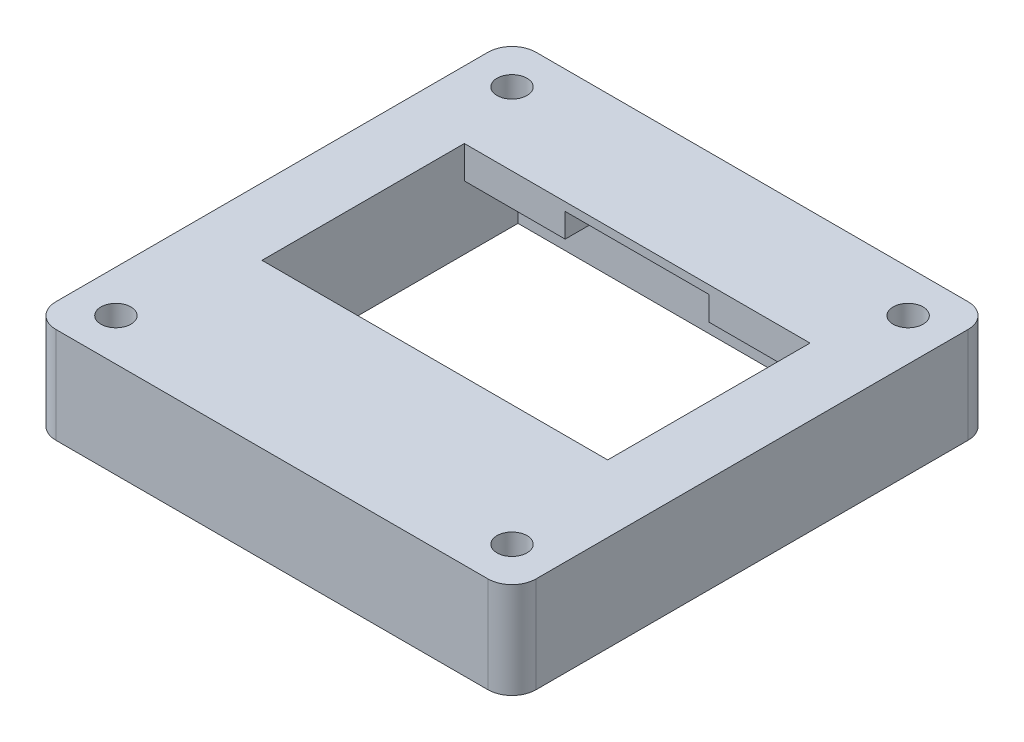
ISO-10303-21;
HEADER;
FILE_DESCRIPTION(('STEP AP214'),'2;1');
FILE_NAME('part.step','',(''),(''),'','','');
FILE_SCHEMA(('AUTOMOTIVE_DESIGN { 1 0 10303 214 1 1 1 1 }'));
ENDSEC;
DATA;
#1=APPLICATION_CONTEXT('core data for automotive mechanical design processes');
#2=APPLICATION_PROTOCOL_DEFINITION('international standard','automotive_design',2000,#1);
#3=PRODUCT_CONTEXT('',#1,'mechanical');
#4=PRODUCT('Part','Part','',(#3));
#5=PRODUCT_RELATED_PRODUCT_CATEGORY('part','',(#4));
#6=PRODUCT_DEFINITION_FORMATION('','',#4);
#7=PRODUCT_DEFINITION_CONTEXT('part definition',#1,'design');
#8=PRODUCT_DEFINITION('design','',#6,#7);
#9=PRODUCT_DEFINITION_SHAPE('','',#8);
#10=(LENGTH_UNIT() NAMED_UNIT(*) SI_UNIT(.MILLI.,.METRE.));
#11=(NAMED_UNIT(*) PLANE_ANGLE_UNIT() SI_UNIT($,.RADIAN.));
#12=(NAMED_UNIT(*) SI_UNIT($,.STERADIAN.) SOLID_ANGLE_UNIT());
#13=UNCERTAINTY_MEASURE_WITH_UNIT(LENGTH_MEASURE(1.E-05),#10,'distance_accuracy_value','');
#14=(GEOMETRIC_REPRESENTATION_CONTEXT(3) GLOBAL_UNCERTAINTY_ASSIGNED_CONTEXT((#13)) GLOBAL_UNIT_ASSIGNED_CONTEXT((#10,
#11,#12)) REPRESENTATION_CONTEXT('',''));
#15=CARTESIAN_POINT('',(0.,0.,0.));
#16=DIRECTION('',(0.,0.,1.));
#17=DIRECTION('',(1.,0.,0.));
#18=AXIS2_PLACEMENT_3D('',#15,#16,#17);
#19=CARTESIAN_POINT('',(-14.4,49.4424902726658,-14.9));
#20=DIRECTION('',(-1.,0.,0.));
#21=DIRECTION('',(0.,0.,1.));
#22=AXIS2_PLACEMENT_3D('',#19,#20,#21);
#23=PLANE('',#22);
#24=DIRECTION('',(0.,0.,1.));
#25=VECTOR('',#24,1.);
#26=CARTESIAN_POINT('',(-14.4,7.5,6.43));
#27=LINE('',#26,#25);
#28=CARTESIAN_POINT('',(-14.4,7.5,6.43));
#29=VERTEX_POINT('',#28);
#30=CARTESIAN_POINT('',(-14.4,7.5,10.43));
#31=VERTEX_POINT('',#30);
#32=EDGE_CURVE('E226',#29,#31,#27,.T.);
#33=ORIENTED_EDGE('',*,*,#32,.T.);
#34=DIRECTION('',(0.,-1.,0.));
#35=VECTOR('',#34,1.);
#36=CARTESIAN_POINT('',(-14.4,8.,10.43));
#37=LINE('',#36,#35);
#38=CARTESIAN_POINT('',(-14.4,5.3,10.43));
#39=VERTEX_POINT('',#38);
#40=EDGE_CURVE('E210',#31,#39,#37,.T.);
#41=ORIENTED_EDGE('',*,*,#40,.T.);
#42=DIRECTION('',(0.,0.,-1.));
#43=VECTOR('',#42,1.);
#44=CARTESIAN_POINT('',(-14.4,5.3,-14.9));
#45=LINE('',#44,#43);
#46=CARTESIAN_POINT('',(-14.4,5.3,14.9));
#47=VERTEX_POINT('',#46);
#48=EDGE_CURVE('E343',#47,#39,#45,.T.);
#49=ORIENTED_EDGE('',*,*,#48,.F.);
#50=DIRECTION('',(0.,-1.,0.));
#51=VECTOR('',#50,1.);
#52=CARTESIAN_POINT('',(-14.4,49.4424902726658,14.9));
#53=LINE('',#52,#51);
#54=CARTESIAN_POINT('',(-14.4,0.,14.9));
#55=VERTEX_POINT('',#54);
#56=EDGE_CURVE('E332',#47,#55,#53,.T.);
#57=ORIENTED_EDGE('',*,*,#56,.T.);
#58=DIRECTION('',(0.,0.,-1.));
#59=VECTOR('',#58,1.);
#60=CARTESIAN_POINT('',(-14.4,0.,-14.9));
#61=LINE('',#60,#59);
#62=CARTESIAN_POINT('',(-14.4,0.,-14.9));
#63=VERTEX_POINT('',#62);
#64=EDGE_CURVE('E321',#55,#63,#61,.T.);
#65=ORIENTED_EDGE('',*,*,#64,.T.);
#66=DIRECTION('',(0.,-1.,0.));
#67=VECTOR('',#66,1.);
#68=CARTESIAN_POINT('',(-14.4,49.4424902726658,-14.9));
#69=LINE('',#68,#67);
#70=CARTESIAN_POINT('',(-14.4,5.3,-14.9));
#71=VERTEX_POINT('',#70);
#72=EDGE_CURVE('E345',#71,#63,#69,.T.);
#73=ORIENTED_EDGE('',*,*,#72,.F.);
#74=CARTESIAN_POINT('',(-14.4,5.3,-10.43));
#75=VERTEX_POINT('',#74);
#76=EDGE_CURVE('E346',#75,#71,#45,.T.);
#77=ORIENTED_EDGE('',*,*,#76,.F.);
#78=DIRECTION('',(0.,-1.,0.));
#79=VECTOR('',#78,1.);
#80=CARTESIAN_POINT('',(-14.4,8.,-10.43));
#81=LINE('',#80,#79);
#82=CARTESIAN_POINT('',(-14.4,8.,-10.43));
#83=VERTEX_POINT('',#82);
#84=EDGE_CURVE('E222',#83,#75,#81,.T.);
#85=ORIENTED_EDGE('',*,*,#84,.F.);
#86=DIRECTION('',(0.,0.,-1.));
#87=VECTOR('',#86,1.);
#88=CARTESIAN_POINT('',(-14.4,8.,-10.43));
#89=LINE('',#88,#87);
#90=CARTESIAN_POINT('',(-14.4,8.,6.43));
#91=VERTEX_POINT('',#90);
#92=EDGE_CURVE('E300',#91,#83,#89,.T.);
#93=ORIENTED_EDGE('',*,*,#92,.F.);
#94=DIRECTION('',(0.,1.,0.));
#95=VECTOR('',#94,1.);
#96=CARTESIAN_POINT('',(-14.4,8.,6.43));
#97=LINE('',#96,#95);
#98=EDGE_CURVE('E228',#29,#91,#97,.T.);
#99=ORIENTED_EDGE('',*,*,#98,.F.);
#100=EDGE_LOOP('',(#33,#41,#49,#57,#65,#73,#77,#85,#93,#99));
#101=FACE_BOUND('',#100,.T.);
#102=ADVANCED_FACE('F38',(#101),#23,.F.);
#103=CARTESIAN_POINT('',(14.4,49.4424902726658,-14.9));
#104=DIRECTION('',(1.,0.,0.));
#105=DIRECTION('',(0.,0.,-1.));
#106=AXIS2_PLACEMENT_3D('',#103,#104,#105);
#107=PLANE('',#106);
#108=DIRECTION('',(0.,0.,1.));
#109=VECTOR('',#108,1.);
#110=CARTESIAN_POINT('',(14.4,7.5,6.43));
#111=LINE('',#110,#109);
#112=CARTESIAN_POINT('',(14.4,7.5,6.43));
#113=VERTEX_POINT('',#112);
#114=CARTESIAN_POINT('',(14.4,7.5,10.43));
#115=VERTEX_POINT('',#114);
#116=EDGE_CURVE('E232',#113,#115,#111,.T.);
#117=ORIENTED_EDGE('',*,*,#116,.F.);
#118=DIRECTION('',(0.,-1.,0.));
#119=VECTOR('',#118,1.);
#120=CARTESIAN_POINT('',(14.4,8.,6.43));
#121=LINE('',#120,#119);
#122=CARTESIAN_POINT('',(14.4,8.,6.43));
#123=VERTEX_POINT('',#122);
#124=EDGE_CURVE('E739',#123,#113,#121,.T.);
#125=ORIENTED_EDGE('',*,*,#124,.F.);
#126=DIRECTION('',(0.,0.,1.));
#127=VECTOR('',#126,1.);
#128=CARTESIAN_POINT('',(14.4,8.,-10.43));
#129=LINE('',#128,#127);
#130=CARTESIAN_POINT('',(14.4,8.,-10.43));
#131=VERTEX_POINT('',#130);
#132=EDGE_CURVE('E297',#131,#123,#129,.T.);
#133=ORIENTED_EDGE('',*,*,#132,.F.);
#134=DIRECTION('',(0.,-1.,0.));
#135=VECTOR('',#134,1.);
#136=CARTESIAN_POINT('',(14.4,8.,-10.43));
#137=LINE('',#136,#135);
#138=CARTESIAN_POINT('',(14.4,5.3,-10.43));
#139=VERTEX_POINT('',#138);
#140=EDGE_CURVE('E312',#131,#139,#137,.T.);
#141=ORIENTED_EDGE('',*,*,#140,.T.);
#142=DIRECTION('',(0.,0.,1.));
#143=VECTOR('',#142,1.);
#144=CARTESIAN_POINT('',(14.4,5.3,-14.9));
#145=LINE('',#144,#143);
#146=CARTESIAN_POINT('',(14.4,5.3,-14.9));
#147=VERTEX_POINT('',#146);
#148=EDGE_CURVE('E333',#147,#139,#145,.T.);
#149=ORIENTED_EDGE('',*,*,#148,.F.);
#150=DIRECTION('',(0.,-1.,0.));
#151=VECTOR('',#150,1.);
#152=CARTESIAN_POINT('',(14.4,49.4424902726658,-14.9));
#153=LINE('',#152,#151);
#154=CARTESIAN_POINT('',(14.4,0.,-14.9));
#155=VERTEX_POINT('',#154);
#156=EDGE_CURVE('E341',#147,#155,#153,.T.);
#157=ORIENTED_EDGE('',*,*,#156,.T.);
#158=DIRECTION('',(0.,0.,1.));
#159=VECTOR('',#158,1.);
#160=CARTESIAN_POINT('',(14.4,0.,-14.9));
#161=LINE('',#160,#159);
#162=CARTESIAN_POINT('',(14.4,0.,14.9));
#163=VERTEX_POINT('',#162);
#164=EDGE_CURVE('E315',#155,#163,#161,.T.);
#165=ORIENTED_EDGE('',*,*,#164,.T.);
#166=DIRECTION('',(0.,-1.,0.));
#167=VECTOR('',#166,1.);
#168=CARTESIAN_POINT('',(14.4,49.4424902726658,14.9));
#169=LINE('',#168,#167);
#170=CARTESIAN_POINT('',(14.4,5.3,14.9));
#171=VERTEX_POINT('',#170);
#172=EDGE_CURVE('E336',#171,#163,#169,.T.);
#173=ORIENTED_EDGE('',*,*,#172,.F.);
#174=CARTESIAN_POINT('',(14.4,5.3,10.43));
#175=VERTEX_POINT('',#174);
#176=EDGE_CURVE('E337',#175,#171,#145,.T.);
#177=ORIENTED_EDGE('',*,*,#176,.F.);
#178=DIRECTION('',(0.,-1.,0.));
#179=VECTOR('',#178,1.);
#180=CARTESIAN_POINT('',(14.4,8.,10.43));
#181=LINE('',#180,#179);
#182=EDGE_CURVE('E223',#115,#175,#181,.T.);
#183=ORIENTED_EDGE('',*,*,#182,.F.);
#184=EDGE_LOOP('',(#117,#125,#133,#141,#149,#157,#165,#173,#177,#183));
#185=FACE_BOUND('',#184,.T.);
#186=ADVANCED_FACE('F442',(#185),#107,.F.);
#187=CARTESIAN_POINT('',(-14.4,8.,10.43));
#188=DIRECTION('',(0.,0.,1.));
#189=DIRECTION('',(1.,0.,0.));
#190=AXIS2_PLACEMENT_3D('',#187,#188,#189);
#191=PLANE('',#190);
#192=DIRECTION('',(-1.,0.,0.));
#193=VECTOR('',#192,1.);
#194=CARTESIAN_POINT('',(-14.4,7.5,10.43));
#195=LINE('',#194,#193);
#196=EDGE_CURVE('E214',#115,#31,#195,.T.);
#197=ORIENTED_EDGE('',*,*,#196,.F.);
#198=ORIENTED_EDGE('',*,*,#182,.T.);
#199=DIRECTION('',(-1.,0.,0.));
#200=VECTOR('',#199,1.);
#201=CARTESIAN_POINT('',(-14.4,5.3,10.43));
#202=LINE('',#201,#200);
#203=CARTESIAN_POINT('',(6.,5.3,10.43));
#204=VERTEX_POINT('',#203);
#205=EDGE_CURVE('E306',#175,#204,#202,.T.);
#206=ORIENTED_EDGE('',*,*,#205,.T.);
#207=DIRECTION('',(0.,-1.,0.));
#208=VECTOR('',#207,1.);
#209=CARTESIAN_POINT('',(6.,20.8055027234389,10.43));
#210=LINE('',#209,#208);
#211=CARTESIAN_POINT('',(6.,7.3,10.43));
#212=VERTEX_POINT('',#211);
#213=EDGE_CURVE('E281',#212,#204,#210,.T.);
#214=ORIENTED_EDGE('',*,*,#213,.F.);
#215=DIRECTION('',(1.,0.,0.));
#216=VECTOR('',#215,1.);
#217=CARTESIAN_POINT('',(-6.,7.3,10.43));
#218=LINE('',#217,#216);
#219=CARTESIAN_POINT('',(-6.,7.3,10.43));
#220=VERTEX_POINT('',#219);
#221=EDGE_CURVE('E277',#220,#212,#218,.T.);
#222=ORIENTED_EDGE('',*,*,#221,.F.);
#223=DIRECTION('',(0.,-1.,0.));
#224=VECTOR('',#223,1.);
#225=CARTESIAN_POINT('',(-6.,20.8055027234389,10.43));
#226=LINE('',#225,#224);
#227=CARTESIAN_POINT('',(-6.,5.3,10.43));
#228=VERTEX_POINT('',#227);
#229=EDGE_CURVE('E284',#220,#228,#226,.T.);
#230=ORIENTED_EDGE('',*,*,#229,.T.);
#231=EDGE_CURVE('E218',#228,#39,#202,.T.);
#232=ORIENTED_EDGE('',*,*,#231,.T.);
#233=ORIENTED_EDGE('',*,*,#40,.F.);
#234=EDGE_LOOP('',(#197,#198,#206,#214,#222,#230,#232,#233));
#235=FACE_BOUND('',#234,.T.);
#236=ADVANCED_FACE('F212',(#235),#191,.F.);
#237=CARTESIAN_POINT('',(0.,5.3,0.));
#238=DIRECTION('',(0.,1.,0.));
#239=DIRECTION('',(0.,0.,1.));
#240=AXIS2_PLACEMENT_3D('',#237,#238,#239);
#241=PLANE('',#240);
#242=DIRECTION('',(1.,0.,0.));
#243=VECTOR('',#242,1.);
#244=CARTESIAN_POINT('',(-14.4,5.3,-14.9));
#245=LINE('',#244,#243);
#246=CARTESIAN_POINT('',(-6.,5.3,-14.9));
#247=VERTEX_POINT('',#246);
#248=EDGE_CURVE('E338',#71,#247,#245,.T.);
#249=ORIENTED_EDGE('',*,*,#248,.T.);
#250=DIRECTION('',(0.,0.,-1.));
#251=VECTOR('',#250,1.);
#252=CARTESIAN_POINT('',(-6.,5.3,-10.43));
#253=LINE('',#252,#251);
#254=CARTESIAN_POINT('',(-6.,5.3,-10.43));
#255=VERTEX_POINT('',#254);
#256=EDGE_CURVE('E249',#255,#247,#253,.T.);
#257=ORIENTED_EDGE('',*,*,#256,.F.);
#258=DIRECTION('',(1.,0.,0.));
#259=VECTOR('',#258,1.);
#260=CARTESIAN_POINT('',(-14.4,5.3,-10.43));
#261=LINE('',#260,#259);
#262=EDGE_CURVE('E301',#75,#255,#261,.T.);
#263=ORIENTED_EDGE('',*,*,#262,.F.);
#264=ORIENTED_EDGE('',*,*,#76,.T.);
#265=EDGE_LOOP('',(#249,#257,#263,#264));
#266=FACE_BOUND('',#265,.T.);
#267=ADVANCED_FACE('F462',(#266),#241,.F.);
#268=DIRECTION('',(-1.,0.,0.));
#269=VECTOR('',#268,1.);
#270=CARTESIAN_POINT('',(-14.4,5.3,14.9));
#271=LINE('',#270,#269);
#272=CARTESIAN_POINT('',(6.,5.3,14.9));
#273=VERTEX_POINT('',#272);
#274=EDGE_CURVE('E329',#171,#273,#271,.T.);
#275=ORIENTED_EDGE('',*,*,#274,.T.);
#276=DIRECTION('',(0.,0.,1.));
#277=VECTOR('',#276,1.);
#278=CARTESIAN_POINT('',(6.,5.3,10.43));
#279=LINE('',#278,#277);
#280=EDGE_CURVE('E274',#204,#273,#279,.T.);
#281=ORIENTED_EDGE('',*,*,#280,.F.);
#282=ORIENTED_EDGE('',*,*,#205,.F.);
#283=ORIENTED_EDGE('',*,*,#176,.T.);
#284=EDGE_LOOP('',(#275,#281,#282,#283));
#285=FACE_BOUND('',#284,.T.);
#286=ADVANCED_FACE('F460',(#285),#241,.F.);
#287=ORIENTED_EDGE('',*,*,#231,.F.);
#288=DIRECTION('',(0.,0.,-1.));
#289=VECTOR('',#288,1.);
#290=CARTESIAN_POINT('',(-6.,5.3,10.43));
#291=LINE('',#290,#289);
#292=CARTESIAN_POINT('',(-6.,5.3,14.9));
#293=VERTEX_POINT('',#292);
#294=EDGE_CURVE('E273',#293,#228,#291,.T.);
#295=ORIENTED_EDGE('',*,*,#294,.F.);
#296=EDGE_CURVE('E320',#293,#47,#271,.T.);
#297=ORIENTED_EDGE('',*,*,#296,.T.);
#298=ORIENTED_EDGE('',*,*,#48,.T.);
#299=EDGE_LOOP('',(#287,#295,#297,#298));
#300=FACE_BOUND('',#299,.T.);
#301=ADVANCED_FACE('F456',(#300),#241,.F.);
#302=CARTESIAN_POINT('',(6.,5.3,-10.43));
#303=VERTEX_POINT('',#302);
#304=EDGE_CURVE('E309',#303,#139,#261,.T.);
#305=ORIENTED_EDGE('',*,*,#304,.F.);
#306=DIRECTION('',(0.,0.,1.));
#307=VECTOR('',#306,1.);
#308=CARTESIAN_POINT('',(6.,5.3,-10.43));
#309=LINE('',#308,#307);
#310=CARTESIAN_POINT('',(6.,5.3,-14.9));
#311=VERTEX_POINT('',#310);
#312=EDGE_CURVE('E248',#311,#303,#309,.T.);
#313=ORIENTED_EDGE('',*,*,#312,.F.);
#314=EDGE_CURVE('E342',#311,#147,#245,.T.);
#315=ORIENTED_EDGE('',*,*,#314,.T.);
#316=ORIENTED_EDGE('',*,*,#148,.T.);
#317=EDGE_LOOP('',(#305,#313,#315,#316));
#318=FACE_BOUND('',#317,.T.);
#319=ADVANCED_FACE('F459',(#318),#241,.F.);
#320=CARTESIAN_POINT('',(20.,8.,-20.));
#321=DIRECTION('',(-1.,0.,0.));
#322=DIRECTION('',(0.,0.,1.));
#323=AXIS2_PLACEMENT_3D('',#320,#321,#322);
#324=PLANE('',#323);
#325=DIRECTION('',(0.,0.,-1.));
#326=VECTOR('',#325,1.);
#327=CARTESIAN_POINT('',(20.,0.,-20.));
#328=LINE('',#327,#326);
#329=CARTESIAN_POINT('',(20.,0.,18.));
#330=VERTEX_POINT('',#329);
#331=CARTESIAN_POINT('',(20.,0.,-18.));
#332=VERTEX_POINT('',#331);
#333=EDGE_CURVE('E352',#330,#332,#328,.T.);
#334=ORIENTED_EDGE('',*,*,#333,.T.);
#335=DIRECTION('',(0.,-1.,0.));
#336=VECTOR('',#335,1.);
#337=CARTESIAN_POINT('',(20.,8.,-18.));
#338=LINE('',#337,#336);
#339=CARTESIAN_POINT('',(20.,8.,-18.));
#340=VERTEX_POINT('',#339);
#341=EDGE_CURVE('E401',#332,#340,#338,.F.);
#342=ORIENTED_EDGE('',*,*,#341,.T.);
#343=DIRECTION('',(0.,0.,-1.));
#344=VECTOR('',#343,1.);
#345=CARTESIAN_POINT('',(20.,8.,-20.));
#346=LINE('',#345,#344);
#347=CARTESIAN_POINT('',(20.,8.,18.));
#348=VERTEX_POINT('',#347);
#349=EDGE_CURVE('E353',#348,#340,#346,.T.);
#350=ORIENTED_EDGE('',*,*,#349,.F.);
#351=DIRECTION('',(0.,-1.,0.));
#352=VECTOR('',#351,1.);
#353=CARTESIAN_POINT('',(20.,8.,18.));
#354=LINE('',#353,#352);
#355=EDGE_CURVE('E398',#348,#330,#354,.T.);
#356=ORIENTED_EDGE('',*,*,#355,.T.);
#357=EDGE_LOOP('',(#334,#342,#350,#356));
#358=FACE_BOUND('',#357,.T.);
#359=ADVANCED_FACE('F417',(#358),#324,.F.);
#360=CARTESIAN_POINT('',(-20.,8.,-20.));
#361=DIRECTION('',(0.,0.,1.));
#362=DIRECTION('',(1.,0.,0.));
#363=AXIS2_PLACEMENT_3D('',#360,#361,#362);
#364=PLANE('',#363);
#365=DIRECTION('',(-1.,0.,0.));
#366=VECTOR('',#365,1.);
#367=CARTESIAN_POINT('',(-20.,0.,-20.));
#368=LINE('',#367,#366);
#369=CARTESIAN_POINT('',(18.,0.,-20.));
#370=VERTEX_POINT('',#369);
#371=CARTESIAN_POINT('',(-18.,0.,-20.));
#372=VERTEX_POINT('',#371);
#373=EDGE_CURVE('E367',#370,#372,#368,.T.);
#374=ORIENTED_EDGE('',*,*,#373,.T.);
#375=DIRECTION('',(0.,-1.,0.));
#376=VECTOR('',#375,1.);
#377=CARTESIAN_POINT('',(-18.,8.,-20.));
#378=LINE('',#377,#376);
#379=CARTESIAN_POINT('',(-18.,8.,-20.));
#380=VERTEX_POINT('',#379);
#381=EDGE_CURVE('E389',#372,#380,#378,.F.);
#382=ORIENTED_EDGE('',*,*,#381,.T.);
#383=DIRECTION('',(-1.,0.,0.));
#384=VECTOR('',#383,1.);
#385=CARTESIAN_POINT('',(-20.,8.,-20.));
#386=LINE('',#385,#384);
#387=CARTESIAN_POINT('',(18.,8.,-20.));
#388=VERTEX_POINT('',#387);
#389=EDGE_CURVE('E356',#388,#380,#386,.T.);
#390=ORIENTED_EDGE('',*,*,#389,.F.);
#391=DIRECTION('',(0.,-1.,0.));
#392=VECTOR('',#391,1.);
#393=CARTESIAN_POINT('',(18.,8.,-20.));
#394=LINE('',#393,#392);
#395=EDGE_CURVE('E386',#388,#370,#394,.T.);
#396=ORIENTED_EDGE('',*,*,#395,.T.);
#397=EDGE_LOOP('',(#374,#382,#390,#396));
#398=FACE_BOUND('',#397,.T.);
#399=ADVANCED_FACE('F427',(#398),#364,.F.);
#400=CARTESIAN_POINT('',(-20.,8.,-20.));
#401=DIRECTION('',(1.,0.,0.));
#402=DIRECTION('',(0.,0.,-1.));
#403=AXIS2_PLACEMENT_3D('',#400,#401,#402);
#404=PLANE('',#403);
#405=DIRECTION('',(0.,0.,1.));
#406=VECTOR('',#405,1.);
#407=CARTESIAN_POINT('',(-20.,8.,-20.));
#408=LINE('',#407,#406);
#409=CARTESIAN_POINT('',(-20.,8.,-18.));
#410=VERTEX_POINT('',#409);
#411=CARTESIAN_POINT('',(-20.,8.,18.));
#412=VERTEX_POINT('',#411);
#413=EDGE_CURVE('E360',#410,#412,#408,.T.);
#414=ORIENTED_EDGE('',*,*,#413,.F.);
#415=DIRECTION('',(0.,-1.,0.));
#416=VECTOR('',#415,1.);
#417=CARTESIAN_POINT('',(-20.,8.,-18.));
#418=LINE('',#417,#416);
#419=CARTESIAN_POINT('',(-20.,0.,-18.));
#420=VERTEX_POINT('',#419);
#421=EDGE_CURVE('E375',#410,#420,#418,.T.);
#422=ORIENTED_EDGE('',*,*,#421,.T.);
#423=DIRECTION('',(0.,0.,1.));
#424=VECTOR('',#423,1.);
#425=CARTESIAN_POINT('',(-20.,0.,-20.));
#426=LINE('',#425,#424);
#427=CARTESIAN_POINT('',(-20.,0.,18.));
#428=VERTEX_POINT('',#427);
#429=EDGE_CURVE('E370',#420,#428,#426,.T.);
#430=ORIENTED_EDGE('',*,*,#429,.T.);
#431=DIRECTION('',(0.,-1.,0.));
#432=VECTOR('',#431,1.);
#433=CARTESIAN_POINT('',(-20.,8.,18.));
#434=LINE('',#433,#432);
#435=EDGE_CURVE('E364',#428,#412,#434,.F.);
#436=ORIENTED_EDGE('',*,*,#435,.T.);
#437=EDGE_LOOP('',(#414,#422,#430,#436));
#438=FACE_BOUND('',#437,.T.);
#439=ADVANCED_FACE('F435',(#438),#404,.F.);
#440=CARTESIAN_POINT('',(-20.,8.,20.));
#441=DIRECTION('',(0.,0.,-1.));
#442=DIRECTION('',(-1.,0.,0.));
#443=AXIS2_PLACEMENT_3D('',#440,#441,#442);
#444=PLANE('',#443);
#445=DIRECTION('',(1.,0.,0.));
#446=VECTOR('',#445,1.);
#447=CARTESIAN_POINT('',(-20.,0.,20.));
#448=LINE('',#447,#446);
#449=CARTESIAN_POINT('',(-18.,0.,20.));
#450=VERTEX_POINT('',#449);
#451=CARTESIAN_POINT('',(18.,0.,20.));
#452=VERTEX_POINT('',#451);
#453=EDGE_CURVE('E357',#450,#452,#448,.T.);
#454=ORIENTED_EDGE('',*,*,#453,.T.);
#455=DIRECTION('',(0.,-1.,0.));
#456=VECTOR('',#455,1.);
#457=CARTESIAN_POINT('',(18.,8.,20.));
#458=LINE('',#457,#456);
#459=CARTESIAN_POINT('',(18.,8.,20.));
#460=VERTEX_POINT('',#459);
#461=EDGE_CURVE('E12',#452,#460,#458,.F.);
#462=ORIENTED_EDGE('',*,*,#461,.T.);
#463=DIRECTION('',(1.,0.,0.));
#464=VECTOR('',#463,1.);
#465=CARTESIAN_POINT('',(-20.,8.,20.));
#466=LINE('',#465,#464);
#467=CARTESIAN_POINT('',(-18.,8.,20.));
#468=VERTEX_POINT('',#467);
#469=EDGE_CURVE('E362',#468,#460,#466,.T.);
#470=ORIENTED_EDGE('',*,*,#469,.F.);
#471=DIRECTION('',(0.,-1.,0.));
#472=VECTOR('',#471,1.);
#473=CARTESIAN_POINT('',(-18.,8.,20.));
#474=LINE('',#473,#472);
#475=EDGE_CURVE('E46',#468,#450,#474,.T.);
#476=ORIENTED_EDGE('',*,*,#475,.T.);
#477=EDGE_LOOP('',(#454,#462,#470,#476));
#478=FACE_BOUND('',#477,.T.);
#479=ADVANCED_FACE('F405',(#478),#444,.F.);
#480=CARTESIAN_POINT('',(0.,8.,0.));
#481=DIRECTION('',(0.,1.,0.));
#482=DIRECTION('',(0.,0.,1.));
#483=AXIS2_PLACEMENT_3D('',#480,#481,#482);
#484=PLANE('',#483);
#485=CARTESIAN_POINT('',(16.5,8.,16.5));
#486=DIRECTION('',(0.,-1.,0.));
#487=DIRECTION('',(0.,0.,-1.));
#488=AXIS2_PLACEMENT_3D('',#485,#486,#487);
#489=CIRCLE('',#488,1.25);
#490=CARTESIAN_POINT('',(16.5,8.,15.25));
#491=VERTEX_POINT('',#490);
#492=EDGE_CURVE('E743',#491,#491,#489,.T.);
#493=ORIENTED_EDGE('',*,*,#492,.T.);
#494=EDGE_LOOP('',(#493));
#495=FACE_BOUND('',#494,.T.);
#496=CARTESIAN_POINT('',(16.5,8.,-16.5));
#497=DIRECTION('',(0.,-1.,0.));
#498=DIRECTION('',(0.,0.,-1.));
#499=AXIS2_PLACEMENT_3D('',#496,#497,#498);
#500=CIRCLE('',#499,1.25);
#501=CARTESIAN_POINT('',(16.5,8.,-17.75));
#502=VERTEX_POINT('',#501);
#503=EDGE_CURVE('E754',#502,#502,#500,.T.);
#504=ORIENTED_EDGE('',*,*,#503,.T.);
#505=EDGE_LOOP('',(#504));
#506=FACE_BOUND('',#505,.T.);
#507=CARTESIAN_POINT('',(-16.5,8.,-16.5));
#508=DIRECTION('',(0.,-1.,0.));
#509=DIRECTION('',(0.,0.,-1.));
#510=AXIS2_PLACEMENT_3D('',#507,#508,#509);
#511=CIRCLE('',#510,1.25);
#512=CARTESIAN_POINT('',(-16.5,8.,-17.75));
#513=VERTEX_POINT('',#512);
#514=EDGE_CURVE('E748',#513,#513,#511,.T.);
#515=ORIENTED_EDGE('',*,*,#514,.T.);
#516=EDGE_LOOP('',(#515));
#517=FACE_BOUND('',#516,.T.);
#518=CARTESIAN_POINT('',(-16.5,8.,16.5));
#519=DIRECTION('',(0.,-1.,0.));
#520=DIRECTION('',(0.,0.,-1.));
#521=AXIS2_PLACEMENT_3D('',#518,#519,#520);
#522=CIRCLE('',#521,1.25);
#523=CARTESIAN_POINT('',(-16.5,8.,15.25));
#524=VERTEX_POINT('',#523);
#525=EDGE_CURVE('E237',#524,#524,#522,.T.);
#526=ORIENTED_EDGE('',*,*,#525,.T.);
#527=EDGE_LOOP('',(#526));
#528=FACE_BOUND('',#527,.T.);
#529=DIRECTION('',(1.,0.,0.));
#530=VECTOR('',#529,1.);
#531=CARTESIAN_POINT('',(-14.4,8.,6.43));
#532=LINE('',#531,#530);
#533=EDGE_CURVE('E239',#91,#123,#532,.T.);
#534=ORIENTED_EDGE('',*,*,#533,.F.);
#535=ORIENTED_EDGE('',*,*,#92,.T.);
#536=DIRECTION('',(1.,0.,0.));
#537=VECTOR('',#536,1.);
#538=CARTESIAN_POINT('',(-14.4,8.,-10.43));
#539=LINE('',#538,#537);
#540=EDGE_CURVE('E303',#83,#131,#539,.T.);
#541=ORIENTED_EDGE('',*,*,#540,.T.);
#542=ORIENTED_EDGE('',*,*,#132,.T.);
#543=EDGE_LOOP('',(#534,#535,#541,#542));
#544=FACE_BOUND('',#543,.T.);
#545=ORIENTED_EDGE('',*,*,#389,.T.);
#546=CARTESIAN_POINT('',(-18.,8.,-18.));
#547=DIRECTION('',(0.,1.,0.));
#548=DIRECTION('',(0.,0.,1.));
#549=AXIS2_PLACEMENT_3D('',#546,#547,#548);
#550=CIRCLE('',#549,2.);
#551=EDGE_CURVE('E396',#380,#410,#550,.T.);
#552=ORIENTED_EDGE('',*,*,#551,.T.);
#553=ORIENTED_EDGE('',*,*,#413,.T.);
#554=CARTESIAN_POINT('',(-18.,8.,18.));
#555=DIRECTION('',(0.,1.,0.));
#556=DIRECTION('',(0.,0.,1.));
#557=AXIS2_PLACEMENT_3D('',#554,#555,#556);
#558=CIRCLE('',#557,2.);
#559=EDGE_CURVE('E58',#412,#468,#558,.T.);
#560=ORIENTED_EDGE('',*,*,#559,.T.);
#561=ORIENTED_EDGE('',*,*,#469,.T.);
#562=CARTESIAN_POINT('',(18.,8.,18.));
#563=DIRECTION('',(0.,1.,0.));
#564=DIRECTION('',(0.,0.,1.));
#565=AXIS2_PLACEMENT_3D('',#562,#563,#564);
#566=CIRCLE('',#565,2.);
#567=EDGE_CURVE('E392',#460,#348,#566,.T.);
#568=ORIENTED_EDGE('',*,*,#567,.T.);
#569=ORIENTED_EDGE('',*,*,#349,.T.);
#570=CARTESIAN_POINT('',(18.,8.,-18.));
#571=DIRECTION('',(0.,1.,0.));
#572=DIRECTION('',(0.,0.,1.));
#573=AXIS2_PLACEMENT_3D('',#570,#571,#572);
#574=CIRCLE('',#573,2.);
#575=EDGE_CURVE('E394',#340,#388,#574,.T.);
#576=ORIENTED_EDGE('',*,*,#575,.T.);
#577=EDGE_LOOP('',(#545,#552,#553,#560,#561,#568,#569,#576));
#578=FACE_BOUND('',#577,.T.);
#579=ADVANCED_FACE('F420',(#495,#506,#517,#528,#544,#578),#484,.T.);
#580=CARTESIAN_POINT('',(0.,0.,0.));
#581=DIRECTION('',(0.,1.,0.));
#582=DIRECTION('',(0.,0.,1.));
#583=AXIS2_PLACEMENT_3D('',#580,#581,#582);
#584=PLANE('',#583);
#585=CARTESIAN_POINT('',(16.5,0.,16.5));
#586=DIRECTION('',(0.,-1.,0.));
#587=DIRECTION('',(0.,0.,-1.));
#588=AXIS2_PLACEMENT_3D('',#585,#586,#587);
#589=CIRCLE('',#588,1.25);
#590=CARTESIAN_POINT('',(16.5,0.,15.25));
#591=VERTEX_POINT('',#590);
#592=EDGE_CURVE('E757',#591,#591,#589,.T.);
#593=ORIENTED_EDGE('',*,*,#592,.F.);
#594=EDGE_LOOP('',(#593));
#595=FACE_BOUND('',#594,.T.);
#596=CARTESIAN_POINT('',(16.5,0.,-16.5));
#597=DIRECTION('',(0.,-1.,0.));
#598=DIRECTION('',(0.,0.,-1.));
#599=AXIS2_PLACEMENT_3D('',#596,#597,#598);
#600=CIRCLE('',#599,1.25);
#601=CARTESIAN_POINT('',(16.5,0.,-17.75));
#602=VERTEX_POINT('',#601);
#603=EDGE_CURVE('E751',#602,#602,#600,.T.);
#604=ORIENTED_EDGE('',*,*,#603,.F.);
#605=EDGE_LOOP('',(#604));
#606=FACE_BOUND('',#605,.T.);
#607=CARTESIAN_POINT('',(-16.5,0.,-16.5));
#608=DIRECTION('',(0.,-1.,0.));
#609=DIRECTION('',(0.,0.,-1.));
#610=AXIS2_PLACEMENT_3D('',#607,#608,#609);
#611=CIRCLE('',#610,1.25);
#612=CARTESIAN_POINT('',(-16.5,0.,-17.75));
#613=VERTEX_POINT('',#612);
#614=EDGE_CURVE('E745',#613,#613,#611,.T.);
#615=ORIENTED_EDGE('',*,*,#614,.F.);
#616=EDGE_LOOP('',(#615));
#617=FACE_BOUND('',#616,.T.);
#618=CARTESIAN_POINT('',(-16.5,0.,16.5));
#619=DIRECTION('',(0.,-1.,0.));
#620=DIRECTION('',(0.,0.,-1.));
#621=AXIS2_PLACEMENT_3D('',#618,#619,#620);
#622=CIRCLE('',#621,1.25);
#623=CARTESIAN_POINT('',(-16.5,0.,15.25));
#624=VERTEX_POINT('',#623);
#625=EDGE_CURVE('E242',#624,#624,#622,.T.);
#626=ORIENTED_EDGE('',*,*,#625,.F.);
#627=EDGE_LOOP('',(#626));
#628=FACE_BOUND('',#627,.T.);
#629=ORIENTED_EDGE('',*,*,#64,.F.);
#630=DIRECTION('',(-1.,0.,0.));
#631=VECTOR('',#630,1.);
#632=CARTESIAN_POINT('',(-14.4,0.,14.9));
#633=LINE('',#632,#631);
#634=EDGE_CURVE('E324',#163,#55,#633,.T.);
#635=ORIENTED_EDGE('',*,*,#634,.F.);
#636=ORIENTED_EDGE('',*,*,#164,.F.);
#637=DIRECTION('',(1.,0.,0.));
#638=VECTOR('',#637,1.);
#639=CARTESIAN_POINT('',(-14.4,0.,-14.9));
#640=LINE('',#639,#638);
#641=EDGE_CURVE('E318',#63,#155,#640,.T.);
#642=ORIENTED_EDGE('',*,*,#641,.F.);
#643=EDGE_LOOP('',(#629,#635,#636,#642));
#644=FACE_BOUND('',#643,.T.);
#645=ORIENTED_EDGE('',*,*,#429,.F.);
#646=CARTESIAN_POINT('',(-18.,0.,-18.));
#647=DIRECTION('',(0.,1.,0.));
#648=DIRECTION('',(0.,0.,1.));
#649=AXIS2_PLACEMENT_3D('',#646,#647,#648);
#650=CIRCLE('',#649,2.);
#651=EDGE_CURVE('E384',#420,#372,#650,.F.);
#652=ORIENTED_EDGE('',*,*,#651,.T.);
#653=ORIENTED_EDGE('',*,*,#373,.F.);
#654=CARTESIAN_POINT('',(18.,0.,-18.));
#655=DIRECTION('',(0.,1.,0.));
#656=DIRECTION('',(0.,0.,1.));
#657=AXIS2_PLACEMENT_3D('',#654,#655,#656);
#658=CIRCLE('',#657,2.);
#659=EDGE_CURVE('E382',#370,#332,#658,.F.);
#660=ORIENTED_EDGE('',*,*,#659,.T.);
#661=ORIENTED_EDGE('',*,*,#333,.F.);
#662=CARTESIAN_POINT('',(18.,0.,18.));
#663=DIRECTION('',(0.,1.,0.));
#664=DIRECTION('',(0.,0.,1.));
#665=AXIS2_PLACEMENT_3D('',#662,#663,#664);
#666=CIRCLE('',#665,2.);
#667=EDGE_CURVE('E380',#330,#452,#666,.F.);
#668=ORIENTED_EDGE('',*,*,#667,.T.);
#669=ORIENTED_EDGE('',*,*,#453,.F.);
#670=CARTESIAN_POINT('',(-18.,0.,18.));
#671=DIRECTION('',(0.,1.,0.));
#672=DIRECTION('',(0.,0.,1.));
#673=AXIS2_PLACEMENT_3D('',#670,#671,#672);
#674=CIRCLE('',#673,2.);
#675=EDGE_CURVE('E378',#450,#428,#674,.F.);
#676=ORIENTED_EDGE('',*,*,#675,.T.);
#677=EDGE_LOOP('',(#645,#652,#653,#660,#661,#668,#669,#676));
#678=FACE_BOUND('',#677,.T.);
#679=ADVANCED_FACE('F409',(#595,#606,#617,#628,#644,#678),#584,.F.);
#680=CARTESIAN_POINT('',(-14.4,49.4424902726658,14.9));
#681=DIRECTION('',(0.,0.,1.));
#682=DIRECTION('',(1.,0.,0.));
#683=AXIS2_PLACEMENT_3D('',#680,#681,#682);
#684=PLANE('',#683);
#685=ORIENTED_EDGE('',*,*,#172,.T.);
#686=ORIENTED_EDGE('',*,*,#634,.T.);
#687=ORIENTED_EDGE('',*,*,#56,.F.);
#688=ORIENTED_EDGE('',*,*,#296,.F.);
#689=DIRECTION('',(0.,-1.,0.));
#690=VECTOR('',#689,1.);
#691=CARTESIAN_POINT('',(-6.,20.8055027234389,14.9));
#692=LINE('',#691,#690);
#693=CARTESIAN_POINT('',(-6.,7.3,14.9));
#694=VERTEX_POINT('',#693);
#695=EDGE_CURVE('E285',#694,#293,#692,.T.);
#696=ORIENTED_EDGE('',*,*,#695,.F.);
#697=DIRECTION('',(-1.,0.,0.));
#698=VECTOR('',#697,1.);
#699=CARTESIAN_POINT('',(-6.,7.3,14.9));
#700=LINE('',#699,#698);
#701=CARTESIAN_POINT('',(6.,7.3,14.9));
#702=VERTEX_POINT('',#701);
#703=EDGE_CURVE('E286',#702,#694,#700,.T.);
#704=ORIENTED_EDGE('',*,*,#703,.F.);
#705=DIRECTION('',(0.,-1.,0.));
#706=VECTOR('',#705,1.);
#707=CARTESIAN_POINT('',(6.,20.8055027234389,14.9));
#708=LINE('',#707,#706);
#709=EDGE_CURVE('E289',#702,#273,#708,.T.);
#710=ORIENTED_EDGE('',*,*,#709,.T.);
#711=ORIENTED_EDGE('',*,*,#274,.F.);
#712=EDGE_LOOP('',(#685,#686,#687,#688,#696,#704,#710,#711));
#713=FACE_BOUND('',#712,.T.);
#714=ADVANCED_FACE('F452',(#713),#684,.F.);
#715=CARTESIAN_POINT('',(-14.4,49.4424902726658,-14.9));
#716=DIRECTION('',(0.,0.,-1.));
#717=DIRECTION('',(-1.,0.,0.));
#718=AXIS2_PLACEMENT_3D('',#715,#716,#717);
#719=PLANE('',#718);
#720=ORIENTED_EDGE('',*,*,#72,.T.);
#721=ORIENTED_EDGE('',*,*,#641,.T.);
#722=ORIENTED_EDGE('',*,*,#156,.F.);
#723=ORIENTED_EDGE('',*,*,#314,.F.);
#724=DIRECTION('',(0.,-1.,0.));
#725=VECTOR('',#724,1.);
#726=CARTESIAN_POINT('',(6.,20.8055027234389,-14.9));
#727=LINE('',#726,#725);
#728=CARTESIAN_POINT('',(6.,7.3,-14.9));
#729=VERTEX_POINT('',#728);
#730=EDGE_CURVE('E260',#729,#311,#727,.T.);
#731=ORIENTED_EDGE('',*,*,#730,.F.);
#732=DIRECTION('',(1.,0.,0.));
#733=VECTOR('',#732,1.);
#734=CARTESIAN_POINT('',(6.,7.3,-14.9));
#735=LINE('',#734,#733);
#736=CARTESIAN_POINT('',(-6.,7.3,-14.9));
#737=VERTEX_POINT('',#736);
#738=EDGE_CURVE('E261',#737,#729,#735,.T.);
#739=ORIENTED_EDGE('',*,*,#738,.F.);
#740=DIRECTION('',(0.,-1.,0.));
#741=VECTOR('',#740,1.);
#742=CARTESIAN_POINT('',(-6.,20.8055027234389,-14.9));
#743=LINE('',#742,#741);
#744=EDGE_CURVE('E264',#737,#247,#743,.T.);
#745=ORIENTED_EDGE('',*,*,#744,.T.);
#746=ORIENTED_EDGE('',*,*,#248,.F.);
#747=EDGE_LOOP('',(#720,#721,#722,#723,#731,#739,#745,#746));
#748=FACE_BOUND('',#747,.T.);
#749=ADVANCED_FACE('F451',(#748),#719,.F.);
#750=CARTESIAN_POINT('',(-14.4,8.,-10.43));
#751=DIRECTION('',(0.,0.,-1.));
#752=DIRECTION('',(-1.,0.,0.));
#753=AXIS2_PLACEMENT_3D('',#750,#751,#752);
#754=PLANE('',#753);
#755=ORIENTED_EDGE('',*,*,#262,.T.);
#756=DIRECTION('',(0.,-1.,0.));
#757=VECTOR('',#756,1.);
#758=CARTESIAN_POINT('',(-6.,20.8055027234389,-10.43));
#759=LINE('',#758,#757);
#760=CARTESIAN_POINT('',(-6.,7.3,-10.43));
#761=VERTEX_POINT('',#760);
#762=EDGE_CURVE('E256',#761,#255,#759,.T.);
#763=ORIENTED_EDGE('',*,*,#762,.F.);
#764=DIRECTION('',(-1.,0.,0.));
#765=VECTOR('',#764,1.);
#766=CARTESIAN_POINT('',(6.,7.3,-10.43));
#767=LINE('',#766,#765);
#768=CARTESIAN_POINT('',(6.,7.3,-10.43));
#769=VERTEX_POINT('',#768);
#770=EDGE_CURVE('E252',#769,#761,#767,.T.);
#771=ORIENTED_EDGE('',*,*,#770,.F.);
#772=DIRECTION('',(0.,-1.,0.));
#773=VECTOR('',#772,1.);
#774=CARTESIAN_POINT('',(6.,20.8055027234389,-10.43));
#775=LINE('',#774,#773);
#776=EDGE_CURVE('E259',#769,#303,#775,.T.);
#777=ORIENTED_EDGE('',*,*,#776,.T.);
#778=ORIENTED_EDGE('',*,*,#304,.T.);
#779=ORIENTED_EDGE('',*,*,#140,.F.);
#780=ORIENTED_EDGE('',*,*,#540,.F.);
#781=ORIENTED_EDGE('',*,*,#84,.T.);
#782=EDGE_LOOP('',(#755,#763,#771,#777,#778,#779,#780,#781));
#783=FACE_BOUND('',#782,.T.);
#784=ADVANCED_FACE('F641',(#783),#754,.F.);
#785=CARTESIAN_POINT('',(0.,7.3,0.));
#786=DIRECTION('',(0.,1.,0.));
#787=DIRECTION('',(0.,0.,1.));
#788=AXIS2_PLACEMENT_3D('',#785,#786,#787);
#789=PLANE('',#788);
#790=DIRECTION('',(0.,0.,-1.));
#791=VECTOR('',#790,1.);
#792=CARTESIAN_POINT('',(-6.,7.3,10.43));
#793=LINE('',#792,#791);
#794=EDGE_CURVE('E282',#694,#220,#793,.T.);
#795=ORIENTED_EDGE('',*,*,#794,.T.);
#796=ORIENTED_EDGE('',*,*,#221,.T.);
#797=DIRECTION('',(0.,0.,1.));
#798=VECTOR('',#797,1.);
#799=CARTESIAN_POINT('',(6.,7.3,10.43));
#800=LINE('',#799,#798);
#801=EDGE_CURVE('E290',#212,#702,#800,.T.);
#802=ORIENTED_EDGE('',*,*,#801,.T.);
#803=ORIENTED_EDGE('',*,*,#703,.T.);
#804=EDGE_LOOP('',(#795,#796,#802,#803));
#805=FACE_BOUND('',#804,.T.);
#806=ADVANCED_FACE('F648',(#805),#789,.F.);
#807=CARTESIAN_POINT('',(6.,20.8055027234389,10.43));
#808=DIRECTION('',(1.,0.,0.));
#809=DIRECTION('',(0.,0.,-1.));
#810=AXIS2_PLACEMENT_3D('',#807,#808,#809);
#811=PLANE('',#810);
#812=ORIENTED_EDGE('',*,*,#213,.T.);
#813=ORIENTED_EDGE('',*,*,#280,.T.);
#814=ORIENTED_EDGE('',*,*,#709,.F.);
#815=ORIENTED_EDGE('',*,*,#801,.F.);
#816=EDGE_LOOP('',(#812,#813,#814,#815));
#817=FACE_BOUND('',#816,.T.);
#818=ADVANCED_FACE('F656',(#817),#811,.F.);
#819=CARTESIAN_POINT('',(-6.,20.8055027234389,10.43));
#820=DIRECTION('',(-1.,0.,0.));
#821=DIRECTION('',(0.,0.,1.));
#822=AXIS2_PLACEMENT_3D('',#819,#820,#821);
#823=PLANE('',#822);
#824=ORIENTED_EDGE('',*,*,#695,.T.);
#825=ORIENTED_EDGE('',*,*,#294,.T.);
#826=ORIENTED_EDGE('',*,*,#229,.F.);
#827=ORIENTED_EDGE('',*,*,#794,.F.);
#828=EDGE_LOOP('',(#824,#825,#826,#827));
#829=FACE_BOUND('',#828,.T.);
#830=ADVANCED_FACE('F664',(#829),#823,.F.);
#831=CARTESIAN_POINT('',(0.,7.3,0.));
#832=DIRECTION('',(0.,1.,0.));
#833=DIRECTION('',(0.,0.,1.));
#834=AXIS2_PLACEMENT_3D('',#831,#832,#833);
#835=PLANE('',#834);
#836=DIRECTION('',(0.,0.,1.));
#837=VECTOR('',#836,1.);
#838=CARTESIAN_POINT('',(6.,7.3,-10.43));
#839=LINE('',#838,#837);
#840=EDGE_CURVE('E257',#729,#769,#839,.T.);
#841=ORIENTED_EDGE('',*,*,#840,.T.);
#842=ORIENTED_EDGE('',*,*,#770,.T.);
#843=DIRECTION('',(0.,0.,-1.));
#844=VECTOR('',#843,1.);
#845=CARTESIAN_POINT('',(-6.,7.3,-10.43));
#846=LINE('',#845,#844);
#847=EDGE_CURVE('E265',#761,#737,#846,.T.);
#848=ORIENTED_EDGE('',*,*,#847,.T.);
#849=ORIENTED_EDGE('',*,*,#738,.T.);
#850=EDGE_LOOP('',(#841,#842,#848,#849));
#851=FACE_BOUND('',#850,.T.);
#852=ADVANCED_FACE('F672',(#851),#835,.F.);
#853=CARTESIAN_POINT('',(-6.,20.8055027234389,-10.43));
#854=DIRECTION('',(-1.,0.,0.));
#855=DIRECTION('',(0.,0.,1.));
#856=AXIS2_PLACEMENT_3D('',#853,#854,#855);
#857=PLANE('',#856);
#858=ORIENTED_EDGE('',*,*,#762,.T.);
#859=ORIENTED_EDGE('',*,*,#256,.T.);
#860=ORIENTED_EDGE('',*,*,#744,.F.);
#861=ORIENTED_EDGE('',*,*,#847,.F.);
#862=EDGE_LOOP('',(#858,#859,#860,#861));
#863=FACE_BOUND('',#862,.T.);
#864=ADVANCED_FACE('F680',(#863),#857,.F.);
#865=CARTESIAN_POINT('',(6.,20.8055027234389,-10.43));
#866=DIRECTION('',(1.,0.,0.));
#867=DIRECTION('',(0.,0.,-1.));
#868=AXIS2_PLACEMENT_3D('',#865,#866,#867);
#869=PLANE('',#868);
#870=ORIENTED_EDGE('',*,*,#730,.T.);
#871=ORIENTED_EDGE('',*,*,#312,.T.);
#872=ORIENTED_EDGE('',*,*,#776,.F.);
#873=ORIENTED_EDGE('',*,*,#840,.F.);
#874=EDGE_LOOP('',(#870,#871,#872,#873));
#875=FACE_BOUND('',#874,.T.);
#876=ADVANCED_FACE('F555',(#875),#869,.F.);
#877=CARTESIAN_POINT('',(-14.4,7.5,6.43));
#878=DIRECTION('',(0.,1.,0.));
#879=DIRECTION('',(-1.,0.,0.));
#880=AXIS2_PLACEMENT_3D('',#877,#878,#879);
#881=PLANE('',#880);
#882=ORIENTED_EDGE('',*,*,#196,.T.);
#883=ORIENTED_EDGE('',*,*,#32,.F.);
#884=DIRECTION('',(-1.,0.,0.));
#885=VECTOR('',#884,1.);
#886=CARTESIAN_POINT('',(-14.4,7.5,6.43));
#887=LINE('',#886,#885);
#888=EDGE_CURVE('E233',#113,#29,#887,.T.);
#889=ORIENTED_EDGE('',*,*,#888,.F.);
#890=ORIENTED_EDGE('',*,*,#116,.T.);
#891=EDGE_LOOP('',(#882,#883,#889,#890));
#892=FACE_BOUND('',#891,.T.);
#893=ADVANCED_FACE('F236',(#892),#881,.F.);
#894=CARTESIAN_POINT('',(0.,0.,6.43));
#895=DIRECTION('',(0.,0.,1.));
#896=DIRECTION('',(1.,0.,0.));
#897=AXIS2_PLACEMENT_3D('',#894,#895,#896);
#898=PLANE('',#897);
#899=ORIENTED_EDGE('',*,*,#98,.T.);
#900=ORIENTED_EDGE('',*,*,#533,.T.);
#901=ORIENTED_EDGE('',*,*,#124,.T.);
#902=ORIENTED_EDGE('',*,*,#888,.T.);
#903=EDGE_LOOP('',(#899,#900,#901,#902));
#904=FACE_BOUND('',#903,.T.);
#905=ADVANCED_FACE('F538',(#904),#898,.F.);
#906=CARTESIAN_POINT('',(-16.5,8.,16.5));
#907=DIRECTION('',(0.,-1.,0.));
#908=DIRECTION('',(0.,0.,-1.));
#909=AXIS2_PLACEMENT_3D('',#906,#907,#908);
#910=CYLINDRICAL_SURFACE('',#909,1.25);
#911=ORIENTED_EDGE('',*,*,#525,.F.);
#912=EDGE_LOOP('',(#911));
#913=FACE_BOUND('',#912,.T.);
#914=ORIENTED_EDGE('',*,*,#625,.T.);
#915=EDGE_LOOP('',(#914));
#916=FACE_BOUND('',#915,.T.);
#917=ADVANCED_FACE('F529',(#913,#916),#910,.F.);
#918=CARTESIAN_POINT('',(-16.5,8.,-16.5));
#919=DIRECTION('',(0.,-1.,0.));
#920=DIRECTION('',(0.,0.,-1.));
#921=AXIS2_PLACEMENT_3D('',#918,#919,#920);
#922=CYLINDRICAL_SURFACE('',#921,1.25);
#923=ORIENTED_EDGE('',*,*,#514,.F.);
#924=EDGE_LOOP('',(#923));
#925=FACE_BOUND('',#924,.T.);
#926=ORIENTED_EDGE('',*,*,#614,.T.);
#927=EDGE_LOOP('',(#926));
#928=FACE_BOUND('',#927,.T.);
#929=ADVANCED_FACE('F520',(#925,#928),#922,.F.);
#930=CARTESIAN_POINT('',(16.5,8.,-16.5));
#931=DIRECTION('',(0.,-1.,0.));
#932=DIRECTION('',(0.,0.,-1.));
#933=AXIS2_PLACEMENT_3D('',#930,#931,#932);
#934=CYLINDRICAL_SURFACE('',#933,1.25);
#935=ORIENTED_EDGE('',*,*,#503,.F.);
#936=EDGE_LOOP('',(#935));
#937=FACE_BOUND('',#936,.T.);
#938=ORIENTED_EDGE('',*,*,#603,.T.);
#939=EDGE_LOOP('',(#938));
#940=FACE_BOUND('',#939,.T.);
#941=ADVANCED_FACE('F510',(#937,#940),#934,.F.);
#942=CARTESIAN_POINT('',(16.5,8.,16.5));
#943=DIRECTION('',(0.,-1.,0.));
#944=DIRECTION('',(0.,0.,-1.));
#945=AXIS2_PLACEMENT_3D('',#942,#943,#944);
#946=CYLINDRICAL_SURFACE('',#945,1.25);
#947=ORIENTED_EDGE('',*,*,#492,.F.);
#948=EDGE_LOOP('',(#947));
#949=FACE_BOUND('',#948,.T.);
#950=ORIENTED_EDGE('',*,*,#592,.T.);
#951=EDGE_LOOP('',(#950));
#952=FACE_BOUND('',#951,.T.);
#953=ADVANCED_FACE('F479',(#949,#952),#946,.F.);
#954=CARTESIAN_POINT('',(-18.,8.,-18.));
#955=DIRECTION('',(0.,-1.,0.));
#956=DIRECTION('',(0.,0.,-1.));
#957=AXIS2_PLACEMENT_3D('',#954,#955,#956);
#958=CYLINDRICAL_SURFACE('',#957,2.);
#959=ORIENTED_EDGE('',*,*,#551,.F.);
#960=ORIENTED_EDGE('',*,*,#381,.F.);
#961=ORIENTED_EDGE('',*,*,#651,.F.);
#962=ORIENTED_EDGE('',*,*,#421,.F.);
#963=EDGE_LOOP('',(#959,#960,#961,#962));
#964=FACE_BOUND('',#963,.T.);
#965=ADVANCED_FACE('F432',(#964),#958,.T.);
#966=CARTESIAN_POINT('',(18.,8.,-18.));
#967=DIRECTION('',(0.,-1.,0.));
#968=DIRECTION('',(0.,0.,-1.));
#969=AXIS2_PLACEMENT_3D('',#966,#967,#968);
#970=CYLINDRICAL_SURFACE('',#969,2.);
#971=ORIENTED_EDGE('',*,*,#575,.F.);
#972=ORIENTED_EDGE('',*,*,#341,.F.);
#973=ORIENTED_EDGE('',*,*,#659,.F.);
#974=ORIENTED_EDGE('',*,*,#395,.F.);
#975=EDGE_LOOP('',(#971,#972,#973,#974));
#976=FACE_BOUND('',#975,.T.);
#977=ADVANCED_FACE('F424',(#976),#970,.T.);
#978=CARTESIAN_POINT('',(18.,8.,18.));
#979=DIRECTION('',(0.,-1.,0.));
#980=DIRECTION('',(0.,0.,-1.));
#981=AXIS2_PLACEMENT_3D('',#978,#979,#980);
#982=CYLINDRICAL_SURFACE('',#981,2.);
#983=ORIENTED_EDGE('',*,*,#567,.F.);
#984=ORIENTED_EDGE('',*,*,#461,.F.);
#985=ORIENTED_EDGE('',*,*,#667,.F.);
#986=ORIENTED_EDGE('',*,*,#355,.F.);
#987=EDGE_LOOP('',(#983,#984,#985,#986));
#988=FACE_BOUND('',#987,.T.);
#989=ADVANCED_FACE('F414',(#988),#982,.T.);
#990=CARTESIAN_POINT('',(-18.,8.,18.));
#991=DIRECTION('',(0.,-1.,0.));
#992=DIRECTION('',(0.,0.,-1.));
#993=AXIS2_PLACEMENT_3D('',#990,#991,#992);
#994=CYLINDRICAL_SURFACE('',#993,2.);
#995=ORIENTED_EDGE('',*,*,#559,.F.);
#996=ORIENTED_EDGE('',*,*,#435,.F.);
#997=ORIENTED_EDGE('',*,*,#675,.F.);
#998=ORIENTED_EDGE('',*,*,#475,.F.);
#999=EDGE_LOOP('',(#995,#996,#997,#998));
#1000=FACE_BOUND('',#999,.T.);
#1001=ADVANCED_FACE('F40',(#1000),#994,.T.);
#1002=CLOSED_SHELL('',(#102,#186,#236,#267,#286,#301,#319,#359,#399,#439,#479,#579,#679,#714,
#749,#784,#806,#818,#830,#852,#864,#876,#893,#905,#917,#929,#941,#953,#965,#977,#989,#1001));
#1003=MANIFOLD_SOLID_BREP('B2',#1002);
#1004=ADVANCED_BREP_SHAPE_REPRESENTATION('',(#18,#1003),#14);
#1005=SHAPE_DEFINITION_REPRESENTATION(#9,#1004);
ENDSEC;
END-ISO-10303-21;
